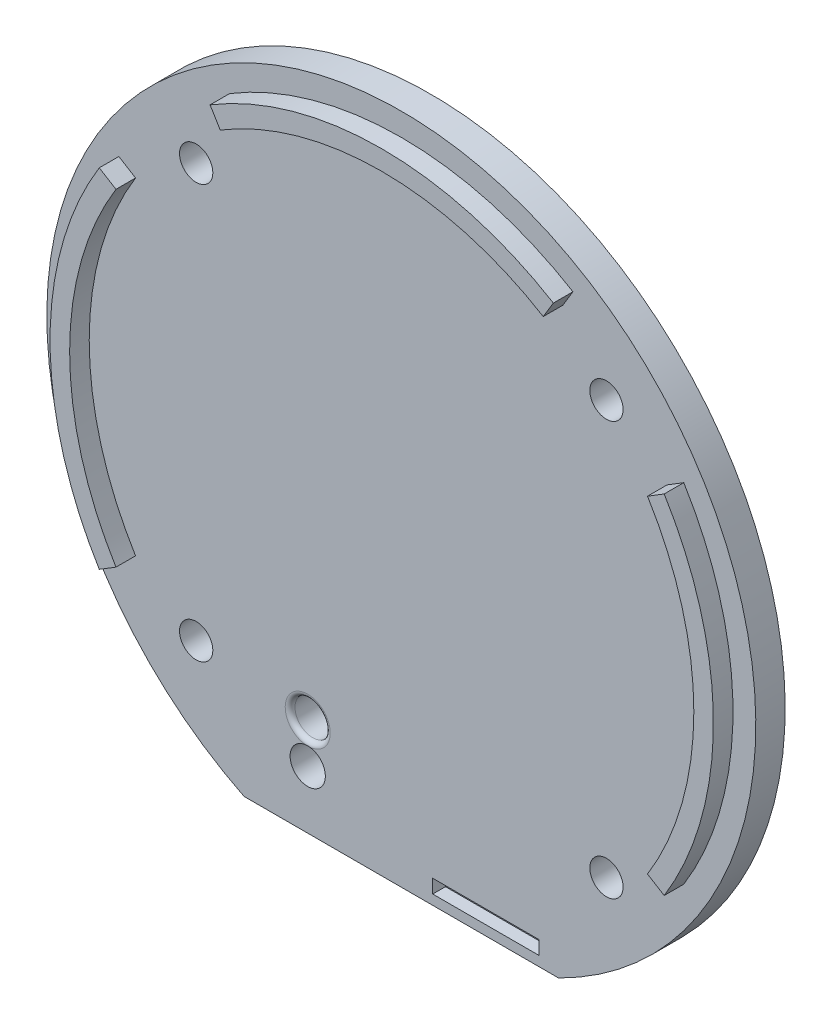
ISO-10303-21;
HEADER;
FILE_DESCRIPTION(('STEP AP214'),'2;1');
FILE_NAME('part.step','',(''),(''),'','','');
FILE_SCHEMA(('AUTOMOTIVE_DESIGN { 1 0 10303 214 1 1 1 1 }'));
ENDSEC;
DATA;
#1=APPLICATION_CONTEXT('core data for automotive mechanical design processes');
#2=APPLICATION_PROTOCOL_DEFINITION('international standard','automotive_design',2000,#1);
#3=PRODUCT_CONTEXT('',#1,'mechanical');
#4=PRODUCT('Part','Part','',(#3));
#5=PRODUCT_RELATED_PRODUCT_CATEGORY('part','',(#4));
#6=PRODUCT_DEFINITION_FORMATION('','',#4);
#7=PRODUCT_DEFINITION_CONTEXT('part definition',#1,'design');
#8=PRODUCT_DEFINITION('design','',#6,#7);
#9=PRODUCT_DEFINITION_SHAPE('','',#8);
#10=(LENGTH_UNIT() NAMED_UNIT(*) SI_UNIT(.MILLI.,.METRE.));
#11=(NAMED_UNIT(*) PLANE_ANGLE_UNIT() SI_UNIT($,.RADIAN.));
#12=(NAMED_UNIT(*) SI_UNIT($,.STERADIAN.) SOLID_ANGLE_UNIT());
#13=UNCERTAINTY_MEASURE_WITH_UNIT(LENGTH_MEASURE(1.E-05),#10,'distance_accuracy_value','');
#14=(GEOMETRIC_REPRESENTATION_CONTEXT(3) GLOBAL_UNCERTAINTY_ASSIGNED_CONTEXT((#13)) GLOBAL_UNIT_ASSIGNED_CONTEXT((#10,
#11,#12)) REPRESENTATION_CONTEXT('',''));
#15=CARTESIAN_POINT('',(0.,0.,0.));
#16=DIRECTION('',(0.,0.,1.));
#17=DIRECTION('',(1.,0.,0.));
#18=AXIS2_PLACEMENT_3D('',#15,#16,#17);
#19=CARTESIAN_POINT('',(0.,0.,3.));
#20=DIRECTION('',(0.,0.,1.));
#21=DIRECTION('',(1.,0.,0.));
#22=AXIS2_PLACEMENT_3D('',#19,#20,#21);
#23=PLANE('',#22);
#24=DIRECTION('',(0.,-1.,0.));
#25=VECTOR('',#24,1.);
#26=CARTESIAN_POINT('',(3.20999999999999,-31.4536669730864,3.));
#27=LINE('',#26,#25);
#28=CARTESIAN_POINT('',(3.20999999999999,-30.0536669730864,3.));
#29=VERTEX_POINT('',#28);
#30=CARTESIAN_POINT('',(3.20999999999999,-31.4536669730864,3.));
#31=VERTEX_POINT('',#30);
#32=EDGE_CURVE('E170',#29,#31,#27,.T.);
#33=ORIENTED_EDGE('',*,*,#32,.F.);
#34=DIRECTION('',(-1.,0.,0.));
#35=VECTOR('',#34,1.);
#36=CARTESIAN_POINT('',(3.20999999999999,-30.0536669730864,3.));
#37=LINE('',#36,#35);
#38=CARTESIAN_POINT('',(14.06,-30.0536669730864,3.));
#39=VERTEX_POINT('',#38);
#40=EDGE_CURVE('E187',#39,#29,#37,.T.);
#41=ORIENTED_EDGE('',*,*,#40,.F.);
#42=DIRECTION('',(0.,1.,0.));
#43=VECTOR('',#42,1.);
#44=CARTESIAN_POINT('',(14.06,-31.4536669730864,3.));
#45=LINE('',#44,#43);
#46=CARTESIAN_POINT('',(14.06,-31.4536669730864,3.));
#47=VERTEX_POINT('',#46);
#48=EDGE_CURVE('E190',#47,#39,#45,.T.);
#49=ORIENTED_EDGE('',*,*,#48,.F.);
#50=DIRECTION('',(1.,0.,0.));
#51=VECTOR('',#50,1.);
#52=CARTESIAN_POINT('',(3.20999999999999,-31.4536669730864,3.));
#53=LINE('',#52,#51);
#54=EDGE_CURVE('E196',#31,#47,#53,.T.);
#55=ORIENTED_EDGE('',*,*,#54,.F.);
#56=EDGE_LOOP('',(#33,#41,#49,#55));
#57=FACE_BOUND('',#56,.T.);
#58=CARTESIAN_POINT('',(-9.56,-26.5236669730864,3.));
#59=DIRECTION('',(0.,0.,1.));
#60=DIRECTION('',(1.,0.,0.));
#61=AXIS2_PLACEMENT_3D('',#58,#59,#60);
#62=CIRCLE('',#61,1.8);
#63=CARTESIAN_POINT('',(-9.31433716531745,-24.7405097249292,3.));
#64=VERTEX_POINT('',#63);
#65=CARTESIAN_POINT('',(-9.80566283468255,-24.7405097249292,3.));
#66=VERTEX_POINT('',#65);
#67=EDGE_CURVE('E210',#64,#66,#62,.F.);
#68=ORIENTED_EDGE('',*,*,#67,.T.);
#69=CARTESIAN_POINT('',(-9.56,-22.4536669730864,3.));
#70=DIRECTION('',(0.,0.,1.));
#71=DIRECTION('',(1.,0.,0.));
#72=AXIS2_PLACEMENT_3D('',#69,#70,#71);
#73=CIRCLE('',#72,2.3);
#74=EDGE_CURVE('E340',#66,#64,#73,.F.);
#75=ORIENTED_EDGE('',*,*,#74,.T.);
#76=EDGE_LOOP('',(#68,#75));
#77=FACE_BOUND('',#76,.T.);
#78=CARTESIAN_POINT('',(20.955,21.12,3.));
#79=DIRECTION('',(0.,0.,1.));
#80=DIRECTION('',(-1.,0.,0.));
#81=AXIS2_PLACEMENT_3D('',#78,#79,#80);
#82=CIRCLE('',#81,1.69999999999999);
#83=CARTESIAN_POINT('',(19.255,21.12,3.));
#84=VERTEX_POINT('',#83);
#85=EDGE_CURVE('E307',#84,#84,#82,.T.);
#86=ORIENTED_EDGE('',*,*,#85,.F.);
#87=EDGE_LOOP('',(#86));
#88=FACE_BOUND('',#87,.T.);
#89=CARTESIAN_POINT('',(-20.955,-21.12,3.));
#90=DIRECTION('',(0.,0.,1.));
#91=DIRECTION('',(1.,0.,0.));
#92=AXIS2_PLACEMENT_3D('',#89,#90,#91);
#93=CIRCLE('',#92,1.7);
#94=CARTESIAN_POINT('',(-19.255,-21.12,3.));
#95=VERTEX_POINT('',#94);
#96=EDGE_CURVE('E306',#95,#95,#93,.T.);
#97=ORIENTED_EDGE('',*,*,#96,.F.);
#98=EDGE_LOOP('',(#97));
#99=FACE_BOUND('',#98,.T.);
#100=CARTESIAN_POINT('',(20.955,-21.12,3.));
#101=DIRECTION('',(0.,0.,1.));
#102=DIRECTION('',(-1.,0.,0.));
#103=AXIS2_PLACEMENT_3D('',#100,#101,#102);
#104=CIRCLE('',#103,1.7);
#105=CARTESIAN_POINT('',(19.255,-21.12,3.));
#106=VERTEX_POINT('',#105);
#107=EDGE_CURVE('E300',#106,#106,#104,.T.);
#108=ORIENTED_EDGE('',*,*,#107,.F.);
#109=EDGE_LOOP('',(#108));
#110=FACE_BOUND('',#109,.T.);
#111=CARTESIAN_POINT('',(-20.955,21.12,3.));
#112=DIRECTION('',(0.,0.,1.));
#113=DIRECTION('',(1.,0.,0.));
#114=AXIS2_PLACEMENT_3D('',#111,#112,#113);
#115=CIRCLE('',#114,1.7);
#116=CARTESIAN_POINT('',(-19.255,21.12,3.));
#117=VERTEX_POINT('',#116);
#118=EDGE_CURVE('E314',#117,#117,#115,.T.);
#119=ORIENTED_EDGE('',*,*,#118,.F.);
#120=EDGE_LOOP('',(#119));
#121=FACE_BOUND('',#120,.T.);
#122=CARTESIAN_POINT('',(0.,0.,3.));
#123=DIRECTION('',(0.,0.,1.));
#124=DIRECTION('',(1.,0.,0.));
#125=AXIS2_PLACEMENT_3D('',#122,#123,#124);
#126=CIRCLE('',#125,36.21);
#127=CARTESIAN_POINT('',(16.06,-32.4536669730864,3.));
#128=VERTEX_POINT('',#127);
#129=CARTESIAN_POINT('',(-16.06,-32.4536669730864,3.));
#130=VERTEX_POINT('',#129);
#131=EDGE_CURVE('E325',#128,#130,#126,.T.);
#132=ORIENTED_EDGE('',*,*,#131,.T.);
#133=DIRECTION('',(1.,0.,0.));
#134=VECTOR('',#133,1.);
#135=CARTESIAN_POINT('',(-16.06,-32.4536669730864,3.));
#136=LINE('',#135,#134);
#137=EDGE_CURVE('E328',#130,#128,#136,.T.);
#138=ORIENTED_EDGE('',*,*,#137,.T.);
#139=EDGE_LOOP('',(#132,#138));
#140=FACE_BOUND('',#139,.T.);
#141=DIRECTION('',(0.851575618923762,0.52423178581102,0.));
#142=VECTOR('',#141,1.);
#143=CARTESIAN_POINT('',(-28.8513819691372,-17.7609729032773,3.));
#144=LINE('',#143,#142);
#145=CARTESIAN_POINT('',(-28.8513819691372,-17.7609729032773,3.));
#146=VERTEX_POINT('',#145);
#147=CARTESIAN_POINT('',(-27.1482307312897,-16.7125093316553,3.));
#148=VERTEX_POINT('',#147);
#149=EDGE_CURVE('E285',#146,#148,#144,.T.);
#150=ORIENTED_EDGE('',*,*,#149,.F.);
#151=CARTESIAN_POINT('',(0.,0.,3.));
#152=DIRECTION('',(0.,0.,1.));
#153=DIRECTION('',(1.,0.,0.));
#154=AXIS2_PLACEMENT_3D('',#151,#152,#153);
#155=CIRCLE('',#154,33.8800000000001);
#156=CARTESIAN_POINT('',(-28.8513819691372,17.7609729032773,3.));
#157=VERTEX_POINT('',#156);
#158=EDGE_CURVE('E271',#157,#146,#155,.T.);
#159=ORIENTED_EDGE('',*,*,#158,.F.);
#160=DIRECTION('',(-0.851575618923764,0.524231785811017,0.));
#161=VECTOR('',#160,1.);
#162=CARTESIAN_POINT('',(-28.8513819691372,17.7609729032773,3.));
#163=LINE('',#162,#161);
#164=CARTESIAN_POINT('',(-27.1482307312897,16.7125093316552,3.));
#165=VERTEX_POINT('',#164);
#166=EDGE_CURVE('E276',#165,#157,#163,.T.);
#167=ORIENTED_EDGE('',*,*,#166,.F.);
#168=CARTESIAN_POINT('',(0.,0.,3.));
#169=DIRECTION('',(0.,0.,-1.));
#170=DIRECTION('',(1.,0.,0.));
#171=AXIS2_PLACEMENT_3D('',#168,#169,#170);
#172=CIRCLE('',#171,31.8800000000001);
#173=EDGE_CURVE('E287',#148,#165,#172,.T.);
#174=ORIENTED_EDGE('',*,*,#173,.F.);
#175=EDGE_LOOP('',(#150,#159,#167,#174));
#176=FACE_BOUND('',#175,.T.);
#177=DIRECTION('',(0.517536740302721,-0.855660985692835,0.));
#178=VECTOR('',#177,1.);
#179=CARTESIAN_POINT('',(-17.5341447614561,28.9897941952734,3.));
#180=LINE('',#179,#178);
#181=CARTESIAN_POINT('',(-17.5341447614561,28.9897941952734,3.));
#182=VERTEX_POINT('',#181);
#183=CARTESIAN_POINT('',(-16.4990712808507,27.2784722238877,3.));
#184=VERTEX_POINT('',#183);
#185=EDGE_CURVE('E256',#182,#184,#180,.T.);
#186=ORIENTED_EDGE('',*,*,#185,.F.);
#187=CARTESIAN_POINT('',(0.,0.,3.));
#188=DIRECTION('',(0.,0.,1.));
#189=DIRECTION('',(1.,0.,0.));
#190=AXIS2_PLACEMENT_3D('',#187,#188,#189);
#191=CIRCLE('',#190,33.8800000000001);
#192=CARTESIAN_POINT('',(17.5341447614561,28.9897941952734,3.));
#193=VERTEX_POINT('',#192);
#194=EDGE_CURVE('E242',#193,#182,#191,.T.);
#195=ORIENTED_EDGE('',*,*,#194,.F.);
#196=DIRECTION('',(0.517536740302719,0.855660985692836,0.));
#197=VECTOR('',#196,1.);
#198=CARTESIAN_POINT('',(17.5341447614561,28.9897941952734,3.));
#199=LINE('',#198,#197);
#200=CARTESIAN_POINT('',(16.4990712808508,27.2784722238877,3.));
#201=VERTEX_POINT('',#200);
#202=EDGE_CURVE('E247',#201,#193,#199,.T.);
#203=ORIENTED_EDGE('',*,*,#202,.F.);
#204=CARTESIAN_POINT('',(0.,0.,3.));
#205=DIRECTION('',(0.,0.,-1.));
#206=DIRECTION('',(1.,0.,0.));
#207=AXIS2_PLACEMENT_3D('',#204,#205,#206);
#208=CIRCLE('',#207,31.8800000000001);
#209=EDGE_CURVE('E258',#184,#201,#208,.T.);
#210=ORIENTED_EDGE('',*,*,#209,.F.);
#211=EDGE_LOOP('',(#186,#195,#203,#210));
#212=FACE_BOUND('',#211,.T.);
#213=DIRECTION('',(-0.851575618923764,-0.524231785811017,0.));
#214=VECTOR('',#213,1.);
#215=CARTESIAN_POINT('',(28.8513819691372,17.7609729032773,3.));
#216=LINE('',#215,#214);
#217=CARTESIAN_POINT('',(28.8513819691372,17.7609729032773,3.));
#218=VERTEX_POINT('',#217);
#219=CARTESIAN_POINT('',(27.1482307312896,16.7125093316553,3.));
#220=VERTEX_POINT('',#219);
#221=EDGE_CURVE('E227',#218,#220,#216,.T.);
#222=ORIENTED_EDGE('',*,*,#221,.F.);
#223=CARTESIAN_POINT('',(0.,0.,3.));
#224=DIRECTION('',(0.,0.,1.));
#225=DIRECTION('',(-1.,0.,0.));
#226=AXIS2_PLACEMENT_3D('',#223,#224,#225);
#227=CIRCLE('',#226,33.8800000000001);
#228=CARTESIAN_POINT('',(28.8513819691372,-17.7609729032773,3.));
#229=VERTEX_POINT('',#228);
#230=EDGE_CURVE('E209',#229,#218,#227,.T.);
#231=ORIENTED_EDGE('',*,*,#230,.F.);
#232=DIRECTION('',(0.851575618923764,-0.524231785811017,0.));
#233=VECTOR('',#232,1.);
#234=CARTESIAN_POINT('',(28.8513819691372,-17.7609729032773,3.));
#235=LINE('',#234,#233);
#236=CARTESIAN_POINT('',(27.1482307312897,-16.7125093316553,3.));
#237=VERTEX_POINT('',#236);
#238=EDGE_CURVE('E218',#237,#229,#235,.T.);
#239=ORIENTED_EDGE('',*,*,#238,.F.);
#240=CARTESIAN_POINT('',(0.,0.,3.));
#241=DIRECTION('',(0.,0.,-1.));
#242=DIRECTION('',(-1.,0.,0.));
#243=AXIS2_PLACEMENT_3D('',#240,#241,#242);
#244=CIRCLE('',#243,31.8800000000001);
#245=EDGE_CURVE('E229',#220,#237,#244,.T.);
#246=ORIENTED_EDGE('',*,*,#245,.F.);
#247=EDGE_LOOP('',(#222,#231,#239,#246));
#248=FACE_BOUND('',#247,.T.);
#249=ADVANCED_FACE('F33',(#57,#77,#88,#99,#110,#121,#140,#176,#212,#248),#23,.T.);
#250=CARTESIAN_POINT('',(0.,0.,3.));
#251=DIRECTION('',(0.,0.,-1.));
#252=DIRECTION('',(-1.,0.,0.));
#253=AXIS2_PLACEMENT_3D('',#250,#251,#252);
#254=CYLINDRICAL_SURFACE('',#253,36.21);
#255=CARTESIAN_POINT('',(0.,0.,0.));
#256=DIRECTION('',(0.,0.,1.));
#257=DIRECTION('',(1.,0.,0.));
#258=AXIS2_PLACEMENT_3D('',#255,#256,#257);
#259=CIRCLE('',#258,36.21);
#260=CARTESIAN_POINT('',(16.06,-32.4536669730864,0.));
#261=VERTEX_POINT('',#260);
#262=CARTESIAN_POINT('',(-16.06,-32.4536669730864,0.));
#263=VERTEX_POINT('',#262);
#264=EDGE_CURVE('E324',#261,#263,#259,.T.);
#265=ORIENTED_EDGE('',*,*,#264,.T.);
#266=DIRECTION('',(0.,0.,-1.));
#267=VECTOR('',#266,1.);
#268=CARTESIAN_POINT('',(-16.06,-32.4536669730864,3.));
#269=LINE('',#268,#267);
#270=EDGE_CURVE('E337',#130,#263,#269,.T.);
#271=ORIENTED_EDGE('',*,*,#270,.F.);
#272=ORIENTED_EDGE('',*,*,#131,.F.);
#273=DIRECTION('',(0.,0.,-1.));
#274=VECTOR('',#273,1.);
#275=CARTESIAN_POINT('',(16.06,-32.4536669730864,3.));
#276=LINE('',#275,#274);
#277=EDGE_CURVE('E331',#128,#261,#276,.T.);
#278=ORIENTED_EDGE('',*,*,#277,.T.);
#279=EDGE_LOOP('',(#265,#271,#272,#278));
#280=FACE_BOUND('',#279,.T.);
#281=ADVANCED_FACE('F433',(#280),#254,.T.);
#282=CARTESIAN_POINT('',(-16.06,-32.4536669730864,3.));
#283=DIRECTION('',(0.,1.,0.));
#284=DIRECTION('',(0.,0.,1.));
#285=AXIS2_PLACEMENT_3D('',#282,#283,#284);
#286=PLANE('',#285);
#287=DIRECTION('',(1.,0.,0.));
#288=VECTOR('',#287,1.);
#289=CARTESIAN_POINT('',(-16.06,-32.4536669730864,0.));
#290=LINE('',#289,#288);
#291=EDGE_CURVE('E329',#263,#261,#290,.T.);
#292=ORIENTED_EDGE('',*,*,#291,.T.);
#293=ORIENTED_EDGE('',*,*,#277,.F.);
#294=ORIENTED_EDGE('',*,*,#137,.F.);
#295=ORIENTED_EDGE('',*,*,#270,.T.);
#296=EDGE_LOOP('',(#292,#293,#294,#295));
#297=FACE_BOUND('',#296,.T.);
#298=ADVANCED_FACE('F437',(#297),#286,.F.);
#299=CARTESIAN_POINT('',(0.,0.,0.));
#300=DIRECTION('',(0.,0.,1.));
#301=DIRECTION('',(1.,0.,0.));
#302=AXIS2_PLACEMENT_3D('',#299,#300,#301);
#303=PLANE('',#302);
#304=CARTESIAN_POINT('',(-9.56,-22.4536669730864,0.));
#305=DIRECTION('',(0.,0.,-1.));
#306=DIRECTION('',(-1.,0.,0.));
#307=AXIS2_PLACEMENT_3D('',#304,#305,#306);
#308=CIRCLE('',#307,1.8);
#309=CARTESIAN_POINT('',(-11.36,-22.4536669730864,0.));
#310=VERTEX_POINT('',#309);
#311=EDGE_CURVE('E206',#310,#310,#308,.T.);
#312=ORIENTED_EDGE('',*,*,#311,.F.);
#313=EDGE_LOOP('',(#312));
#314=FACE_BOUND('',#313,.T.);
#315=CARTESIAN_POINT('',(-9.56,-26.5236669730864,0.));
#316=DIRECTION('',(0.,0.,-1.));
#317=DIRECTION('',(-1.,0.,0.));
#318=AXIS2_PLACEMENT_3D('',#315,#316,#317);
#319=CIRCLE('',#318,1.8);
#320=CARTESIAN_POINT('',(-11.36,-26.5236669730864,0.));
#321=VERTEX_POINT('',#320);
#322=EDGE_CURVE('E202',#321,#321,#319,.T.);
#323=ORIENTED_EDGE('',*,*,#322,.F.);
#324=EDGE_LOOP('',(#323));
#325=FACE_BOUND('',#324,.T.);
#326=CARTESIAN_POINT('',(20.955,21.12,0.));
#327=DIRECTION('',(0.,0.,1.));
#328=DIRECTION('',(1.,0.,0.));
#329=AXIS2_PLACEMENT_3D('',#326,#327,#328);
#330=CIRCLE('',#329,1.69999999999999);
#331=CARTESIAN_POINT('',(22.655,21.12,0.));
#332=VERTEX_POINT('',#331);
#333=EDGE_CURVE('E310',#332,#332,#330,.F.);
#334=ORIENTED_EDGE('',*,*,#333,.F.);
#335=EDGE_LOOP('',(#334));
#336=FACE_BOUND('',#335,.T.);
#337=CARTESIAN_POINT('',(-20.955,-21.12,0.));
#338=DIRECTION('',(0.,0.,1.));
#339=DIRECTION('',(1.,0.,0.));
#340=AXIS2_PLACEMENT_3D('',#337,#338,#339);
#341=CIRCLE('',#340,1.7);
#342=CARTESIAN_POINT('',(-19.255,-21.12,0.));
#343=VERTEX_POINT('',#342);
#344=EDGE_CURVE('E311',#343,#343,#341,.F.);
#345=ORIENTED_EDGE('',*,*,#344,.F.);
#346=EDGE_LOOP('',(#345));
#347=FACE_BOUND('',#346,.T.);
#348=CARTESIAN_POINT('',(20.955,-21.12,0.));
#349=DIRECTION('',(0.,0.,1.));
#350=DIRECTION('',(1.,0.,0.));
#351=AXIS2_PLACEMENT_3D('',#348,#349,#350);
#352=CIRCLE('',#351,1.7);
#353=CARTESIAN_POINT('',(22.655,-21.12,0.));
#354=VERTEX_POINT('',#353);
#355=EDGE_CURVE('E303',#354,#354,#352,.F.);
#356=ORIENTED_EDGE('',*,*,#355,.F.);
#357=EDGE_LOOP('',(#356));
#358=FACE_BOUND('',#357,.T.);
#359=CARTESIAN_POINT('',(-20.955,21.12,0.));
#360=DIRECTION('',(0.,0.,1.));
#361=DIRECTION('',(1.,0.,0.));
#362=AXIS2_PLACEMENT_3D('',#359,#360,#361);
#363=CIRCLE('',#362,1.7);
#364=CARTESIAN_POINT('',(-19.255,21.12,0.));
#365=VERTEX_POINT('',#364);
#366=EDGE_CURVE('E321',#365,#365,#363,.F.);
#367=ORIENTED_EDGE('',*,*,#366,.F.);
#368=EDGE_LOOP('',(#367));
#369=FACE_BOUND('',#368,.T.);
#370=ORIENTED_EDGE('',*,*,#264,.F.);
#371=ORIENTED_EDGE('',*,*,#291,.F.);
#372=EDGE_LOOP('',(#370,#371));
#373=FACE_BOUND('',#372,.T.);
#374=ADVANCED_FACE('F429',(#314,#325,#336,#347,#358,#369,#373),#303,.F.);
#375=CARTESIAN_POINT('',(-20.955,21.12,-4.80832611206852));
#376=DIRECTION('',(0.,0.,1.));
#377=DIRECTION('',(1.,0.,0.));
#378=AXIS2_PLACEMENT_3D('',#375,#376,#377);
#379=CYLINDRICAL_SURFACE('',#378,1.7);
#380=ORIENTED_EDGE('',*,*,#366,.T.);
#381=EDGE_LOOP('',(#380));
#382=FACE_BOUND('',#381,.T.);
#383=ORIENTED_EDGE('',*,*,#118,.T.);
#384=EDGE_LOOP('',(#383));
#385=FACE_BOUND('',#384,.T.);
#386=ADVANCED_FACE('F419',(#382,#385),#379,.F.);
#387=CARTESIAN_POINT('',(20.955,-21.12,-4.80832611206852));
#388=DIRECTION('',(0.,0.,1.));
#389=DIRECTION('',(1.,0.,0.));
#390=AXIS2_PLACEMENT_3D('',#387,#388,#389);
#391=CYLINDRICAL_SURFACE('',#390,1.7);
#392=ORIENTED_EDGE('',*,*,#355,.T.);
#393=EDGE_LOOP('',(#392));
#394=FACE_BOUND('',#393,.T.);
#395=ORIENTED_EDGE('',*,*,#107,.T.);
#396=EDGE_LOOP('',(#395));
#397=FACE_BOUND('',#396,.T.);
#398=ADVANCED_FACE('F415',(#394,#397),#391,.F.);
#399=CARTESIAN_POINT('',(-20.955,-21.12,-4.80832611206852));
#400=DIRECTION('',(0.,0.,1.));
#401=DIRECTION('',(1.,0.,0.));
#402=AXIS2_PLACEMENT_3D('',#399,#400,#401);
#403=CYLINDRICAL_SURFACE('',#402,1.7);
#404=ORIENTED_EDGE('',*,*,#344,.T.);
#405=EDGE_LOOP('',(#404));
#406=FACE_BOUND('',#405,.T.);
#407=ORIENTED_EDGE('',*,*,#96,.T.);
#408=EDGE_LOOP('',(#407));
#409=FACE_BOUND('',#408,.T.);
#410=ADVANCED_FACE('F418',(#406,#409),#403,.F.);
#411=CARTESIAN_POINT('',(20.955,21.12,-4.80832611206852));
#412=DIRECTION('',(0.,0.,1.));
#413=DIRECTION('',(1.,0.,0.));
#414=AXIS2_PLACEMENT_3D('',#411,#412,#413);
#415=CYLINDRICAL_SURFACE('',#414,1.69999999999999);
#416=ORIENTED_EDGE('',*,*,#333,.T.);
#417=EDGE_LOOP('',(#416));
#418=FACE_BOUND('',#417,.T.);
#419=ORIENTED_EDGE('',*,*,#85,.T.);
#420=EDGE_LOOP('',(#419));
#421=FACE_BOUND('',#420,.T.);
#422=ADVANCED_FACE('F413',(#418,#421),#415,.F.);
#423=CARTESIAN_POINT('',(0.,0.,5.));
#424=DIRECTION('',(0.,0.,-1.));
#425=DIRECTION('',(-1.,0.,0.));
#426=AXIS2_PLACEMENT_3D('',#423,#424,#425);
#427=CYLINDRICAL_SURFACE('',#426,33.8800000000001);
#428=ORIENTED_EDGE('',*,*,#158,.T.);
#429=DIRECTION('',(0.,0.,-1.));
#430=VECTOR('',#429,1.);
#431=CARTESIAN_POINT('',(-28.8513819691372,-17.7609729032773,5.));
#432=LINE('',#431,#430);
#433=CARTESIAN_POINT('',(-28.8513819691372,-17.7609729032773,5.));
#434=VERTEX_POINT('',#433);
#435=EDGE_CURVE('E298',#434,#146,#432,.T.);
#436=ORIENTED_EDGE('',*,*,#435,.F.);
#437=CARTESIAN_POINT('',(0.,0.,5.));
#438=DIRECTION('',(0.,0.,1.));
#439=DIRECTION('',(1.,0.,0.));
#440=AXIS2_PLACEMENT_3D('',#437,#438,#439);
#441=CIRCLE('',#440,33.8800000000001);
#442=CARTESIAN_POINT('',(-28.8513819691372,17.7609729032773,5.));
#443=VERTEX_POINT('',#442);
#444=EDGE_CURVE('E272',#443,#434,#441,.T.);
#445=ORIENTED_EDGE('',*,*,#444,.F.);
#446=DIRECTION('',(0.,0.,-1.));
#447=VECTOR('',#446,1.);
#448=CARTESIAN_POINT('',(-28.8513819691372,17.7609729032773,5.));
#449=LINE('',#448,#447);
#450=EDGE_CURVE('E282',#443,#157,#449,.T.);
#451=ORIENTED_EDGE('',*,*,#450,.T.);
#452=EDGE_LOOP('',(#428,#436,#445,#451));
#453=FACE_BOUND('',#452,.T.);
#454=ADVANCED_FACE('F409',(#453),#427,.T.);
#455=CARTESIAN_POINT('',(-28.8513819691372,-17.7609729032773,5.));
#456=DIRECTION('',(-0.52423178581102,0.851575618923762,0.));
#457=DIRECTION('',(-0.851575618923762,-0.52423178581102,0.));
#458=AXIS2_PLACEMENT_3D('',#455,#456,#457);
#459=PLANE('',#458);
#460=ORIENTED_EDGE('',*,*,#149,.T.);
#461=DIRECTION('',(0.,0.,-1.));
#462=VECTOR('',#461,1.);
#463=CARTESIAN_POINT('',(-27.1482307312897,-16.7125093316553,5.));
#464=LINE('',#463,#462);
#465=CARTESIAN_POINT('',(-27.1482307312897,-16.7125093316553,5.));
#466=VERTEX_POINT('',#465);
#467=EDGE_CURVE('E295',#466,#148,#464,.T.);
#468=ORIENTED_EDGE('',*,*,#467,.F.);
#469=DIRECTION('',(0.851575618923762,0.52423178581102,0.));
#470=VECTOR('',#469,1.);
#471=CARTESIAN_POINT('',(-28.8513819691372,-17.7609729032773,5.));
#472=LINE('',#471,#470);
#473=EDGE_CURVE('E275',#434,#466,#472,.T.);
#474=ORIENTED_EDGE('',*,*,#473,.F.);
#475=ORIENTED_EDGE('',*,*,#435,.T.);
#476=EDGE_LOOP('',(#460,#468,#474,#475));
#477=FACE_BOUND('',#476,.T.);
#478=ADVANCED_FACE('F405',(#477),#459,.F.);
#479=CARTESIAN_POINT('',(0.,0.,5.));
#480=DIRECTION('',(0.,0.,-1.));
#481=DIRECTION('',(-1.,0.,0.));
#482=AXIS2_PLACEMENT_3D('',#479,#480,#481);
#483=CYLINDRICAL_SURFACE('',#482,31.8800000000001);
#484=ORIENTED_EDGE('',*,*,#173,.T.);
#485=DIRECTION('',(0.,0.,-1.));
#486=VECTOR('',#485,1.);
#487=CARTESIAN_POINT('',(-27.1482307312897,16.7125093316553,5.));
#488=LINE('',#487,#486);
#489=CARTESIAN_POINT('',(-27.1482307312897,16.7125093316553,5.));
#490=VERTEX_POINT('',#489);
#491=EDGE_CURVE('E293',#490,#165,#488,.T.);
#492=ORIENTED_EDGE('',*,*,#491,.F.);
#493=CARTESIAN_POINT('',(0.,0.,5.));
#494=DIRECTION('',(0.,0.,-1.));
#495=DIRECTION('',(1.,0.,0.));
#496=AXIS2_PLACEMENT_3D('',#493,#494,#495);
#497=CIRCLE('',#496,31.8800000000001);
#498=EDGE_CURVE('E278',#466,#490,#497,.T.);
#499=ORIENTED_EDGE('',*,*,#498,.F.);
#500=ORIENTED_EDGE('',*,*,#467,.T.);
#501=EDGE_LOOP('',(#484,#492,#499,#500));
#502=FACE_BOUND('',#501,.T.);
#503=ADVANCED_FACE('F401',(#502),#483,.F.);
#504=CARTESIAN_POINT('',(-28.8513819691372,17.7609729032773,5.));
#505=DIRECTION('',(-0.524231785811017,-0.851575618923764,0.));
#506=DIRECTION('',(0.851575618923765,-0.524231785811017,0.));
#507=AXIS2_PLACEMENT_3D('',#504,#505,#506);
#508=PLANE('',#507);
#509=ORIENTED_EDGE('',*,*,#166,.T.);
#510=ORIENTED_EDGE('',*,*,#450,.F.);
#511=DIRECTION('',(-0.851575618923764,0.524231785811017,0.));
#512=VECTOR('',#511,1.);
#513=CARTESIAN_POINT('',(-28.8513819691372,17.7609729032773,5.));
#514=LINE('',#513,#512);
#515=EDGE_CURVE('E280',#490,#443,#514,.T.);
#516=ORIENTED_EDGE('',*,*,#515,.F.);
#517=ORIENTED_EDGE('',*,*,#491,.T.);
#518=EDGE_LOOP('',(#509,#510,#516,#517));
#519=FACE_BOUND('',#518,.T.);
#520=ADVANCED_FACE('F397',(#519),#508,.F.);
#521=CARTESIAN_POINT('',(0.,0.,5.));
#522=DIRECTION('',(0.,0.,1.));
#523=DIRECTION('',(1.,0.,0.));
#524=AXIS2_PLACEMENT_3D('',#521,#522,#523);
#525=PLANE('',#524);
#526=ORIENTED_EDGE('',*,*,#444,.T.);
#527=ORIENTED_EDGE('',*,*,#473,.T.);
#528=ORIENTED_EDGE('',*,*,#498,.T.);
#529=ORIENTED_EDGE('',*,*,#515,.T.);
#530=EDGE_LOOP('',(#526,#527,#528,#529));
#531=FACE_BOUND('',#530,.T.);
#532=ADVANCED_FACE('F393',(#531),#525,.T.);
#533=CARTESIAN_POINT('',(0.,0.,5.));
#534=DIRECTION('',(0.,0.,-1.));
#535=DIRECTION('',(-1.,0.,0.));
#536=AXIS2_PLACEMENT_3D('',#533,#534,#535);
#537=CYLINDRICAL_SURFACE('',#536,33.8800000000001);
#538=ORIENTED_EDGE('',*,*,#194,.T.);
#539=DIRECTION('',(0.,0.,-1.));
#540=VECTOR('',#539,1.);
#541=CARTESIAN_POINT('',(-17.5341447614561,28.9897941952734,5.));
#542=LINE('',#541,#540);
#543=CARTESIAN_POINT('',(-17.5341447614561,28.9897941952734,5.));
#544=VERTEX_POINT('',#543);
#545=EDGE_CURVE('E269',#544,#182,#542,.T.);
#546=ORIENTED_EDGE('',*,*,#545,.F.);
#547=CARTESIAN_POINT('',(0.,0.,5.));
#548=DIRECTION('',(0.,0.,1.));
#549=DIRECTION('',(1.,0.,0.));
#550=AXIS2_PLACEMENT_3D('',#547,#548,#549);
#551=CIRCLE('',#550,33.8800000000001);
#552=CARTESIAN_POINT('',(17.5341447614561,28.9897941952734,5.));
#553=VERTEX_POINT('',#552);
#554=EDGE_CURVE('E243',#553,#544,#551,.T.);
#555=ORIENTED_EDGE('',*,*,#554,.F.);
#556=DIRECTION('',(0.,0.,-1.));
#557=VECTOR('',#556,1.);
#558=CARTESIAN_POINT('',(17.5341447614561,28.9897941952734,5.));
#559=LINE('',#558,#557);
#560=EDGE_CURVE('E253',#553,#193,#559,.T.);
#561=ORIENTED_EDGE('',*,*,#560,.T.);
#562=EDGE_LOOP('',(#538,#546,#555,#561));
#563=FACE_BOUND('',#562,.T.);
#564=ADVANCED_FACE('F389',(#563),#537,.T.);
#565=CARTESIAN_POINT('',(-17.5341447614561,28.9897941952734,5.));
#566=DIRECTION('',(0.855660985692835,0.517536740302721,0.));
#567=DIRECTION('',(-0.517536740302721,0.855660985692835,0.));
#568=AXIS2_PLACEMENT_3D('',#565,#566,#567);
#569=PLANE('',#568);
#570=ORIENTED_EDGE('',*,*,#185,.T.);
#571=DIRECTION('',(0.,0.,-1.));
#572=VECTOR('',#571,1.);
#573=CARTESIAN_POINT('',(-16.4990712808507,27.2784722238877,5.));
#574=LINE('',#573,#572);
#575=CARTESIAN_POINT('',(-16.4990712808507,27.2784722238877,5.));
#576=VERTEX_POINT('',#575);
#577=EDGE_CURVE('E266',#576,#184,#574,.T.);
#578=ORIENTED_EDGE('',*,*,#577,.F.);
#579=DIRECTION('',(0.517536740302721,-0.855660985692835,0.));
#580=VECTOR('',#579,1.);
#581=CARTESIAN_POINT('',(-17.5341447614561,28.9897941952734,5.));
#582=LINE('',#581,#580);
#583=EDGE_CURVE('E246',#544,#576,#582,.T.);
#584=ORIENTED_EDGE('',*,*,#583,.F.);
#585=ORIENTED_EDGE('',*,*,#545,.T.);
#586=EDGE_LOOP('',(#570,#578,#584,#585));
#587=FACE_BOUND('',#586,.T.);
#588=ADVANCED_FACE('F385',(#587),#569,.F.);
#589=CARTESIAN_POINT('',(0.,0.,5.));
#590=DIRECTION('',(0.,0.,-1.));
#591=DIRECTION('',(-1.,0.,0.));
#592=AXIS2_PLACEMENT_3D('',#589,#590,#591);
#593=CYLINDRICAL_SURFACE('',#592,31.8800000000001);
#594=ORIENTED_EDGE('',*,*,#209,.T.);
#595=DIRECTION('',(0.,0.,-1.));
#596=VECTOR('',#595,1.);
#597=CARTESIAN_POINT('',(16.4990712808507,27.2784722238877,5.));
#598=LINE('',#597,#596);
#599=CARTESIAN_POINT('',(16.4990712808507,27.2784722238877,5.));
#600=VERTEX_POINT('',#599);
#601=EDGE_CURVE('E264',#600,#201,#598,.T.);
#602=ORIENTED_EDGE('',*,*,#601,.F.);
#603=CARTESIAN_POINT('',(0.,0.,5.));
#604=DIRECTION('',(0.,0.,-1.));
#605=DIRECTION('',(1.,0.,0.));
#606=AXIS2_PLACEMENT_3D('',#603,#604,#605);
#607=CIRCLE('',#606,31.8800000000001);
#608=EDGE_CURVE('E249',#576,#600,#607,.T.);
#609=ORIENTED_EDGE('',*,*,#608,.F.);
#610=ORIENTED_EDGE('',*,*,#577,.T.);
#611=EDGE_LOOP('',(#594,#602,#609,#610));
#612=FACE_BOUND('',#611,.T.);
#613=ADVANCED_FACE('F381',(#612),#593,.F.);
#614=CARTESIAN_POINT('',(17.5341447614561,28.9897941952734,5.));
#615=DIRECTION('',(-0.855660985692836,0.517536740302719,0.));
#616=DIRECTION('',(-0.517536740302719,-0.855660985692836,0.));
#617=AXIS2_PLACEMENT_3D('',#614,#615,#616);
#618=PLANE('',#617);
#619=ORIENTED_EDGE('',*,*,#202,.T.);
#620=ORIENTED_EDGE('',*,*,#560,.F.);
#621=DIRECTION('',(0.517536740302719,0.855660985692836,0.));
#622=VECTOR('',#621,1.);
#623=CARTESIAN_POINT('',(17.5341447614561,28.9897941952734,5.));
#624=LINE('',#623,#622);
#625=EDGE_CURVE('E251',#600,#553,#624,.T.);
#626=ORIENTED_EDGE('',*,*,#625,.F.);
#627=ORIENTED_EDGE('',*,*,#601,.T.);
#628=EDGE_LOOP('',(#619,#620,#626,#627));
#629=FACE_BOUND('',#628,.T.);
#630=ADVANCED_FACE('F377',(#629),#618,.F.);
#631=CARTESIAN_POINT('',(0.,0.,5.));
#632=DIRECTION('',(0.,0.,1.));
#633=DIRECTION('',(1.,0.,0.));
#634=AXIS2_PLACEMENT_3D('',#631,#632,#633);
#635=PLANE('',#634);
#636=ORIENTED_EDGE('',*,*,#554,.T.);
#637=ORIENTED_EDGE('',*,*,#583,.T.);
#638=ORIENTED_EDGE('',*,*,#608,.T.);
#639=ORIENTED_EDGE('',*,*,#625,.T.);
#640=EDGE_LOOP('',(#636,#637,#638,#639));
#641=FACE_BOUND('',#640,.T.);
#642=ADVANCED_FACE('F373',(#641),#635,.T.);
#643=CARTESIAN_POINT('',(0.,0.,5.));
#644=DIRECTION('',(0.,0.,-1.));
#645=DIRECTION('',(-1.,0.,0.));
#646=AXIS2_PLACEMENT_3D('',#643,#644,#645);
#647=CYLINDRICAL_SURFACE('',#646,33.8800000000001);
#648=ORIENTED_EDGE('',*,*,#230,.T.);
#649=DIRECTION('',(0.,0.,-1.));
#650=VECTOR('',#649,1.);
#651=CARTESIAN_POINT('',(28.8513819691372,17.7609729032773,5.));
#652=LINE('',#651,#650);
#653=CARTESIAN_POINT('',(28.8513819691372,17.7609729032773,5.));
#654=VERTEX_POINT('',#653);
#655=EDGE_CURVE('E240',#654,#218,#652,.T.);
#656=ORIENTED_EDGE('',*,*,#655,.F.);
#657=CARTESIAN_POINT('',(0.,0.,5.));
#658=DIRECTION('',(0.,0.,1.));
#659=DIRECTION('',(-1.,0.,0.));
#660=AXIS2_PLACEMENT_3D('',#657,#658,#659);
#661=CIRCLE('',#660,33.8800000000001);
#662=CARTESIAN_POINT('',(28.8513819691372,-17.7609729032773,5.));
#663=VERTEX_POINT('',#662);
#664=EDGE_CURVE('E214',#663,#654,#661,.T.);
#665=ORIENTED_EDGE('',*,*,#664,.F.);
#666=DIRECTION('',(0.,0.,-1.));
#667=VECTOR('',#666,1.);
#668=CARTESIAN_POINT('',(28.8513819691372,-17.7609729032773,5.));
#669=LINE('',#668,#667);
#670=EDGE_CURVE('E224',#663,#229,#669,.T.);
#671=ORIENTED_EDGE('',*,*,#670,.T.);
#672=EDGE_LOOP('',(#648,#656,#665,#671));
#673=FACE_BOUND('',#672,.T.);
#674=ADVANCED_FACE('F369',(#673),#647,.T.);
#675=CARTESIAN_POINT('',(28.8513819691372,17.7609729032773,5.));
#676=DIRECTION('',(0.524231785811017,-0.851575618923764,0.));
#677=DIRECTION('',(0.851575618923764,0.524231785811017,0.));
#678=AXIS2_PLACEMENT_3D('',#675,#676,#677);
#679=PLANE('',#678);
#680=ORIENTED_EDGE('',*,*,#221,.T.);
#681=DIRECTION('',(0.,0.,-1.));
#682=VECTOR('',#681,1.);
#683=CARTESIAN_POINT('',(27.1482307312896,16.7125093316553,5.));
#684=LINE('',#683,#682);
#685=CARTESIAN_POINT('',(27.1482307312896,16.7125093316553,5.));
#686=VERTEX_POINT('',#685);
#687=EDGE_CURVE('E237',#686,#220,#684,.T.);
#688=ORIENTED_EDGE('',*,*,#687,.F.);
#689=DIRECTION('',(-0.851575618923764,-0.524231785811017,0.));
#690=VECTOR('',#689,1.);
#691=CARTESIAN_POINT('',(28.8513819691372,17.7609729032773,5.));
#692=LINE('',#691,#690);
#693=EDGE_CURVE('E217',#654,#686,#692,.T.);
#694=ORIENTED_EDGE('',*,*,#693,.F.);
#695=ORIENTED_EDGE('',*,*,#655,.T.);
#696=EDGE_LOOP('',(#680,#688,#694,#695));
#697=FACE_BOUND('',#696,.T.);
#698=ADVANCED_FACE('F365',(#697),#679,.F.);
#699=CARTESIAN_POINT('',(0.,0.,5.));
#700=DIRECTION('',(0.,0.,-1.));
#701=DIRECTION('',(-1.,0.,0.));
#702=AXIS2_PLACEMENT_3D('',#699,#700,#701);
#703=CYLINDRICAL_SURFACE('',#702,31.8800000000001);
#704=ORIENTED_EDGE('',*,*,#245,.T.);
#705=DIRECTION('',(0.,0.,-1.));
#706=VECTOR('',#705,1.);
#707=CARTESIAN_POINT('',(27.1482307312897,-16.7125093316553,5.));
#708=LINE('',#707,#706);
#709=CARTESIAN_POINT('',(27.1482307312897,-16.7125093316553,5.));
#710=VERTEX_POINT('',#709);
#711=EDGE_CURVE('E235',#710,#237,#708,.T.);
#712=ORIENTED_EDGE('',*,*,#711,.F.);
#713=CARTESIAN_POINT('',(0.,0.,5.));
#714=DIRECTION('',(0.,0.,-1.));
#715=DIRECTION('',(-1.,0.,0.));
#716=AXIS2_PLACEMENT_3D('',#713,#714,#715);
#717=CIRCLE('',#716,31.8800000000001);
#718=EDGE_CURVE('E220',#686,#710,#717,.T.);
#719=ORIENTED_EDGE('',*,*,#718,.F.);
#720=ORIENTED_EDGE('',*,*,#687,.T.);
#721=EDGE_LOOP('',(#704,#712,#719,#720));
#722=FACE_BOUND('',#721,.T.);
#723=ADVANCED_FACE('F361',(#722),#703,.F.);
#724=CARTESIAN_POINT('',(28.8513819691372,-17.7609729032773,5.));
#725=DIRECTION('',(0.524231785811017,0.851575618923764,0.));
#726=DIRECTION('',(-0.851575618923764,0.524231785811017,0.));
#727=AXIS2_PLACEMENT_3D('',#724,#725,#726);
#728=PLANE('',#727);
#729=ORIENTED_EDGE('',*,*,#238,.T.);
#730=ORIENTED_EDGE('',*,*,#670,.F.);
#731=DIRECTION('',(0.851575618923764,-0.524231785811017,0.));
#732=VECTOR('',#731,1.);
#733=CARTESIAN_POINT('',(28.8513819691372,-17.7609729032773,5.));
#734=LINE('',#733,#732);
#735=EDGE_CURVE('E222',#710,#663,#734,.T.);
#736=ORIENTED_EDGE('',*,*,#735,.F.);
#737=ORIENTED_EDGE('',*,*,#711,.T.);
#738=EDGE_LOOP('',(#729,#730,#736,#737));
#739=FACE_BOUND('',#738,.T.);
#740=ADVANCED_FACE('F357',(#739),#728,.F.);
#741=CARTESIAN_POINT('',(0.,0.,5.));
#742=DIRECTION('',(0.,0.,-1.));
#743=DIRECTION('',(-1.,0.,0.));
#744=AXIS2_PLACEMENT_3D('',#741,#742,#743);
#745=PLANE('',#744);
#746=ORIENTED_EDGE('',*,*,#664,.T.);
#747=ORIENTED_EDGE('',*,*,#693,.T.);
#748=ORIENTED_EDGE('',*,*,#718,.T.);
#749=ORIENTED_EDGE('',*,*,#735,.T.);
#750=EDGE_LOOP('',(#746,#747,#748,#749));
#751=FACE_BOUND('',#750,.T.);
#752=ADVANCED_FACE('F352',(#751),#745,.F.);
#753=CARTESIAN_POINT('',(-9.56,-26.5236669730864,8.09116882454314));
#754=DIRECTION('',(0.,0.,-1.));
#755=DIRECTION('',(-1.,0.,0.));
#756=AXIS2_PLACEMENT_3D('',#753,#754,#755);
#757=CYLINDRICAL_SURFACE('',#756,1.8);
#758=ORIENTED_EDGE('',*,*,#322,.T.);
#759=EDGE_LOOP('',(#758));
#760=FACE_BOUND('',#759,.T.);
#761=ORIENTED_EDGE('',*,*,#67,.F.);
#762=CARTESIAN_POINT('',(-9.31433716531745,-24.7405097249292,3.));
#763=CARTESIAN_POINT('',(-9.33473000557566,-24.7377002328452,2.99999679150393));
#764=CARTESIAN_POINT('',(-9.35516922351472,-24.7352408539632,2.99992628833841));
#765=CARTESIAN_POINT('',(-9.39611988832108,-24.7310244973695,2.99973088195722));
#766=CARTESIAN_POINT('',(-9.41663133565126,-24.7292675241675,2.99960597839228));
#767=CARTESIAN_POINT('',(-9.47804440962642,-24.7250670944257,2.99927103691595));
#768=CARTESIAN_POINT('',(-9.51902220481321,-24.7236669730864,2.99909918883021));
#769=CARTESIAN_POINT('',(-9.60097779518679,-24.7236669730864,2.99909918883021));
#770=CARTESIAN_POINT('',(-9.64195559037358,-24.7250670944257,2.99927103691595));
#771=CARTESIAN_POINT('',(-9.70336866434874,-24.7292675241675,2.99960597839228));
#772=CARTESIAN_POINT('',(-9.72388011167892,-24.7310244973695,2.99973088195722));
#773=CARTESIAN_POINT('',(-9.76483077648528,-24.7352408539632,2.99992628833841));
#774=CARTESIAN_POINT('',(-9.78526999442434,-24.7377002328452,2.99999679150393));
#775=CARTESIAN_POINT('',(-9.80566283468255,-24.7405097249292,3.));
#776=B_SPLINE_CURVE_WITH_KNOTS('',3,(#762,#763,#764,#765,#766,#767,#768,#769,#770,#771,#772,
#773,#774,#775),.UNSPECIFIED.,.F.,.F.,(4,2,2,2,2,2,4),(0.,0.0617498034151435,0.123500003284733,
0.246403778414385,0.369307553544039,0.431057753413626,0.492807556828772),.UNSPECIFIED.);
#777=EDGE_CURVE('E42',#64,#66,#776,.T.);
#778=ORIENTED_EDGE('',*,*,#777,.T.);
#779=EDGE_LOOP('',(#761,#778));
#780=FACE_BOUND('',#779,.T.);
#781=ADVANCED_FACE('F346',(#760,#780),#757,.F.);
#782=CARTESIAN_POINT('',(-9.56,-22.4536669730864,8.09116882454314));
#783=DIRECTION('',(0.,0.,-1.));
#784=DIRECTION('',(-1.,0.,0.));
#785=AXIS2_PLACEMENT_3D('',#782,#783,#784);
#786=CYLINDRICAL_SURFACE('',#785,1.8);
#787=CARTESIAN_POINT('',(-9.56,-22.4536669730864,2.5));
#788=DIRECTION('',(0.,0.,1.));
#789=DIRECTION('',(1.,0.,0.));
#790=AXIS2_PLACEMENT_3D('',#787,#788,#789);
#791=CIRCLE('',#790,1.8);
#792=CARTESIAN_POINT('',(-7.76,-22.4536669730864,2.5));
#793=VERTEX_POINT('',#792);
#794=EDGE_CURVE('E11',#793,#793,#791,.T.);
#795=ORIENTED_EDGE('',*,*,#794,.T.);
#796=EDGE_LOOP('',(#795));
#797=FACE_BOUND('',#796,.T.);
#798=ORIENTED_EDGE('',*,*,#311,.T.);
#799=EDGE_LOOP('',(#798));
#800=FACE_BOUND('',#799,.T.);
#801=ADVANCED_FACE('F351',(#797,#800),#786,.F.);
#802=CARTESIAN_POINT('',(3.20999999999999,-31.4536669730864,1.7));
#803=DIRECTION('',(-1.,0.,0.));
#804=DIRECTION('',(0.,0.,1.));
#805=AXIS2_PLACEMENT_3D('',#802,#803,#804);
#806=PLANE('',#805);
#807=ORIENTED_EDGE('',*,*,#32,.T.);
#808=DIRECTION('',(0.,0.,1.));
#809=VECTOR('',#808,1.);
#810=CARTESIAN_POINT('',(3.20999999999999,-31.4536669730864,1.7));
#811=LINE('',#810,#809);
#812=CARTESIAN_POINT('',(3.20999999999999,-31.4536669730864,1.7));
#813=VERTEX_POINT('',#812);
#814=EDGE_CURVE('E163',#813,#31,#811,.T.);
#815=ORIENTED_EDGE('',*,*,#814,.F.);
#816=DIRECTION('',(0.,-1.,0.));
#817=VECTOR('',#816,1.);
#818=CARTESIAN_POINT('',(3.20999999999999,-31.4536669730864,1.7));
#819=LINE('',#818,#817);
#820=CARTESIAN_POINT('',(3.20999999999999,-30.0536669730864,1.7));
#821=VERTEX_POINT('',#820);
#822=EDGE_CURVE('E167',#821,#813,#819,.T.);
#823=ORIENTED_EDGE('',*,*,#822,.F.);
#824=DIRECTION('',(0.,0.,1.));
#825=VECTOR('',#824,1.);
#826=CARTESIAN_POINT('',(3.20999999999999,-30.0536669730864,1.7));
#827=LINE('',#826,#825);
#828=EDGE_CURVE('E200',#821,#29,#827,.T.);
#829=ORIENTED_EDGE('',*,*,#828,.T.);
#830=EDGE_LOOP('',(#807,#815,#823,#829));
#831=FACE_BOUND('',#830,.T.);
#832=ADVANCED_FACE('F165',(#831),#806,.F.);
#833=CARTESIAN_POINT('',(3.20999999999999,-30.0536669730864,1.7));
#834=DIRECTION('',(0.,1.,0.));
#835=DIRECTION('',(0.,0.,1.));
#836=AXIS2_PLACEMENT_3D('',#833,#834,#835);
#837=PLANE('',#836);
#838=ORIENTED_EDGE('',*,*,#40,.T.);
#839=ORIENTED_EDGE('',*,*,#828,.F.);
#840=DIRECTION('',(-1.,0.,0.));
#841=VECTOR('',#840,1.);
#842=CARTESIAN_POINT('',(3.20999999999999,-30.0536669730864,1.7));
#843=LINE('',#842,#841);
#844=CARTESIAN_POINT('',(14.06,-30.0536669730864,1.7));
#845=VERTEX_POINT('',#844);
#846=EDGE_CURVE('E175',#845,#821,#843,.T.);
#847=ORIENTED_EDGE('',*,*,#846,.F.);
#848=DIRECTION('',(0.,0.,1.));
#849=VECTOR('',#848,1.);
#850=CARTESIAN_POINT('',(14.06,-30.0536669730864,1.7));
#851=LINE('',#850,#849);
#852=EDGE_CURVE('E203',#845,#39,#851,.T.);
#853=ORIENTED_EDGE('',*,*,#852,.T.);
#854=EDGE_LOOP('',(#838,#839,#847,#853));
#855=FACE_BOUND('',#854,.T.);
#856=ADVANCED_FACE('F590',(#855),#837,.F.);
#857=CARTESIAN_POINT('',(14.06,-31.4536669730864,1.7));
#858=DIRECTION('',(1.,0.,0.));
#859=DIRECTION('',(0.,0.,-1.));
#860=AXIS2_PLACEMENT_3D('',#857,#858,#859);
#861=PLANE('',#860);
#862=ORIENTED_EDGE('',*,*,#48,.T.);
#863=ORIENTED_EDGE('',*,*,#852,.F.);
#864=DIRECTION('',(0.,1.,0.));
#865=VECTOR('',#864,1.);
#866=CARTESIAN_POINT('',(14.06,-31.4536669730864,1.7));
#867=LINE('',#866,#865);
#868=CARTESIAN_POINT('',(14.06,-31.4536669730864,1.7));
#869=VERTEX_POINT('',#868);
#870=EDGE_CURVE('E183',#869,#845,#867,.T.);
#871=ORIENTED_EDGE('',*,*,#870,.F.);
#872=DIRECTION('',(0.,0.,1.));
#873=VECTOR('',#872,1.);
#874=CARTESIAN_POINT('',(14.06,-31.4536669730864,1.7));
#875=LINE('',#874,#873);
#876=EDGE_CURVE('E174',#869,#47,#875,.T.);
#877=ORIENTED_EDGE('',*,*,#876,.T.);
#878=EDGE_LOOP('',(#862,#863,#871,#877));
#879=FACE_BOUND('',#878,.T.);
#880=ADVANCED_FACE('F596',(#879),#861,.F.);
#881=CARTESIAN_POINT('',(3.20999999999999,-31.4536669730864,1.7));
#882=DIRECTION('',(0.,-1.,0.));
#883=DIRECTION('',(0.,0.,-1.));
#884=AXIS2_PLACEMENT_3D('',#881,#882,#883);
#885=PLANE('',#884);
#886=ORIENTED_EDGE('',*,*,#54,.T.);
#887=ORIENTED_EDGE('',*,*,#876,.F.);
#888=DIRECTION('',(1.,0.,0.));
#889=VECTOR('',#888,1.);
#890=CARTESIAN_POINT('',(3.20999999999999,-31.4536669730864,1.7));
#891=LINE('',#890,#889);
#892=EDGE_CURVE('E178',#813,#869,#891,.T.);
#893=ORIENTED_EDGE('',*,*,#892,.F.);
#894=ORIENTED_EDGE('',*,*,#814,.T.);
#895=EDGE_LOOP('',(#886,#887,#893,#894));
#896=FACE_BOUND('',#895,.T.);
#897=ADVANCED_FACE('F179',(#896),#885,.F.);
#898=CARTESIAN_POINT('',(0.,0.,1.7));
#899=DIRECTION('',(0.,0.,-1.));
#900=DIRECTION('',(-1.,0.,0.));
#901=AXIS2_PLACEMENT_3D('',#898,#899,#900);
#902=PLANE('',#901);
#903=ORIENTED_EDGE('',*,*,#822,.T.);
#904=ORIENTED_EDGE('',*,*,#892,.T.);
#905=ORIENTED_EDGE('',*,*,#870,.T.);
#906=ORIENTED_EDGE('',*,*,#846,.T.);
#907=EDGE_LOOP('',(#903,#904,#905,#906));
#908=FACE_BOUND('',#907,.T.);
#909=ADVANCED_FACE('F185',(#908),#902,.F.);
#910=CARTESIAN_POINT('',(-9.56,-22.4536669730864,2.5));
#911=DIRECTION('',(0.,0.,1.));
#912=DIRECTION('',(1.,0.,0.));
#913=AXIS2_PLACEMENT_3D('',#910,#911,#912);
#914=TOROIDAL_SURFACE('',#913,2.3,0.5);
#915=ORIENTED_EDGE('',*,*,#794,.F.);
#916=EDGE_LOOP('',(#915));
#917=FACE_BOUND('',#916,.T.);
#918=ORIENTED_EDGE('',*,*,#777,.F.);
#919=ORIENTED_EDGE('',*,*,#74,.F.);
#920=EDGE_LOOP('',(#918,#919));
#921=FACE_BOUND('',#920,.T.);
#922=ADVANCED_FACE('F35',(#917,#921),#914,.T.);
#923=CLOSED_SHELL('',(#249,#281,#298,#374,#386,#398,#410,#422,#454,#478,#503,#520,#532,#564,
#588,#613,#630,#642,#674,#698,#723,#740,#752,#781,#801,#832,#856,#880,#897,#909,#922));
#924=MANIFOLD_SOLID_BREP('B2',#923);
#925=ADVANCED_BREP_SHAPE_REPRESENTATION('',(#18,#924),#14);
#926=SHAPE_DEFINITION_REPRESENTATION(#9,#925);
ENDSEC;
END-ISO-10303-21;
